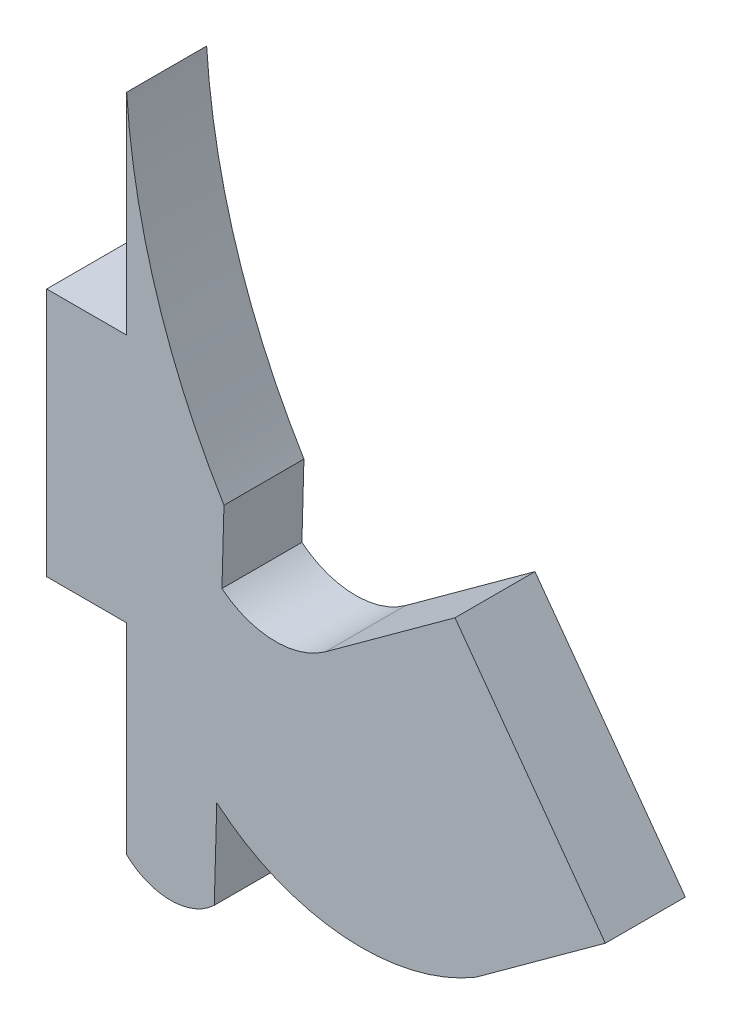
ISO-10303-21;
HEADER;
FILE_DESCRIPTION(('STEP AP214'),'2;1');
FILE_NAME('part.step','',(''),(''),'','','');
FILE_SCHEMA(('AUTOMOTIVE_DESIGN { 1 0 10303 214 1 1 1 1 }'));
ENDSEC;
DATA;
#1=APPLICATION_CONTEXT('core data for automotive mechanical design processes');
#2=APPLICATION_PROTOCOL_DEFINITION('international standard','automotive_design',2000,#1);
#3=PRODUCT_CONTEXT('',#1,'mechanical');
#4=PRODUCT('Part','Part','',(#3));
#5=PRODUCT_RELATED_PRODUCT_CATEGORY('part','',(#4));
#6=PRODUCT_DEFINITION_FORMATION('','',#4);
#7=PRODUCT_DEFINITION_CONTEXT('part definition',#1,'design');
#8=PRODUCT_DEFINITION('design','',#6,#7);
#9=PRODUCT_DEFINITION_SHAPE('','',#8);
#10=(LENGTH_UNIT() NAMED_UNIT(*) SI_UNIT(.MILLI.,.METRE.));
#11=(NAMED_UNIT(*) PLANE_ANGLE_UNIT() SI_UNIT($,.RADIAN.));
#12=(NAMED_UNIT(*) SI_UNIT($,.STERADIAN.) SOLID_ANGLE_UNIT());
#13=UNCERTAINTY_MEASURE_WITH_UNIT(LENGTH_MEASURE(1.E-05),#10,'distance_accuracy_value','');
#14=(GEOMETRIC_REPRESENTATION_CONTEXT(3) GLOBAL_UNCERTAINTY_ASSIGNED_CONTEXT((#13)) GLOBAL_UNIT_ASSIGNED_CONTEXT((#10,
#11,#12)) REPRESENTATION_CONTEXT('',''));
#15=CARTESIAN_POINT('',(0.,0.,0.));
#16=DIRECTION('',(0.,0.,1.));
#17=DIRECTION('',(1.,0.,0.));
#18=AXIS2_PLACEMENT_3D('',#15,#16,#17);
#19=CARTESIAN_POINT('',(1.524,26.9676802822344,1.524));
#20=DIRECTION('',(1.,0.,0.));
#21=DIRECTION('',(0.,0.,-1.));
#22=AXIS2_PLACEMENT_3D('',#19,#20,#21);
#23=PLANE('',#22);
#24=DIRECTION('',(0.,-1.,0.));
#25=VECTOR('',#24,1.);
#26=CARTESIAN_POINT('',(1.524,26.9676802822344,0.));
#27=LINE('',#26,#25);
#28=CARTESIAN_POINT('',(1.524,30.9773636520418,0.));
#29=VERTEX_POINT('',#28);
#30=CARTESIAN_POINT('',(1.524,26.9676802822344,0.));
#31=VERTEX_POINT('',#30);
#32=EDGE_CURVE('E165',#29,#31,#27,.T.);
#33=ORIENTED_EDGE('',*,*,#32,.T.);
#34=DIRECTION('',(0.,0.,-1.));
#35=VECTOR('',#34,1.);
#36=CARTESIAN_POINT('',(1.524,26.9676802822344,1.524));
#37=LINE('',#36,#35);
#38=CARTESIAN_POINT('',(1.524,26.9676802822344,1.524));
#39=VERTEX_POINT('',#38);
#40=EDGE_CURVE('E11',#39,#31,#37,.T.);
#41=ORIENTED_EDGE('',*,*,#40,.F.);
#42=DIRECTION('',(0.,-1.,0.));
#43=VECTOR('',#42,1.);
#44=CARTESIAN_POINT('',(1.524,26.9676802822344,1.524));
#45=LINE('',#44,#43);
#46=CARTESIAN_POINT('',(1.524,30.9773636520418,1.524));
#47=VERTEX_POINT('',#46);
#48=EDGE_CURVE('E191',#47,#39,#45,.T.);
#49=ORIENTED_EDGE('',*,*,#48,.F.);
#50=DIRECTION('',(0.,0.,-1.));
#51=VECTOR('',#50,1.);
#52=CARTESIAN_POINT('',(1.524,30.9773636520418,1.524));
#53=LINE('',#52,#51);
#54=EDGE_CURVE('E161',#47,#29,#53,.T.);
#55=ORIENTED_EDGE('',*,*,#54,.T.);
#56=EDGE_LOOP('',(#33,#41,#49,#55));
#57=FACE_BOUND('',#56,.T.);
#58=ADVANCED_FACE('F33',(#57),#23,.F.);
#59=CARTESIAN_POINT('',(1.524,26.9676802822344,1.524));
#60=DIRECTION('',(0.,-1.,0.));
#61=DIRECTION('',(0.,0.,-1.));
#62=AXIS2_PLACEMENT_3D('',#59,#60,#61);
#63=PLANE('',#62);
#64=DIRECTION('',(-1.,0.,0.));
#65=VECTOR('',#64,1.);
#66=CARTESIAN_POINT('',(1.524,26.9676802822344,0.));
#67=LINE('',#66,#65);
#68=CARTESIAN_POINT('',(0.,26.9676802822344,0.));
#69=VERTEX_POINT('',#68);
#70=EDGE_CURVE('E168',#31,#69,#67,.T.);
#71=ORIENTED_EDGE('',*,*,#70,.T.);
#72=DIRECTION('',(0.,0.,-1.));
#73=VECTOR('',#72,1.);
#74=CARTESIAN_POINT('',(0.,26.9676802822344,1.524));
#75=LINE('',#74,#73);
#76=CARTESIAN_POINT('',(0.,26.9676802822344,1.524));
#77=VERTEX_POINT('',#76);
#78=EDGE_CURVE('E41',#77,#69,#75,.T.);
#79=ORIENTED_EDGE('',*,*,#78,.F.);
#80=DIRECTION('',(-1.,0.,0.));
#81=VECTOR('',#80,1.);
#82=CARTESIAN_POINT('',(1.524,26.9676802822344,1.524));
#83=LINE('',#82,#81);
#84=EDGE_CURVE('E110',#39,#77,#83,.T.);
#85=ORIENTED_EDGE('',*,*,#84,.F.);
#86=ORIENTED_EDGE('',*,*,#40,.T.);
#87=EDGE_LOOP('',(#71,#79,#85,#86));
#88=FACE_BOUND('',#87,.T.);
#89=ADVANCED_FACE('F279',(#88),#63,.F.);
#90=CARTESIAN_POINT('',(0.,26.9676802822344,1.524));
#91=DIRECTION('',(1.,0.,0.));
#92=DIRECTION('',(0.,1.,0.));
#93=AXIS2_PLACEMENT_3D('',#90,#91,#92);
#94=PLANE('',#93);
#95=DIRECTION('',(0.,-1.,0.));
#96=VECTOR('',#95,1.);
#97=CARTESIAN_POINT('',(0.,26.9676802822344,0.));
#98=LINE('',#97,#96);
#99=CARTESIAN_POINT('',(0.,22.2178802822344,0.));
#100=VERTEX_POINT('',#99);
#101=EDGE_CURVE('E170',#69,#100,#98,.T.);
#102=ORIENTED_EDGE('',*,*,#101,.T.);
#103=DIRECTION('',(0.,0.,-1.));
#104=VECTOR('',#103,1.);
#105=CARTESIAN_POINT('',(0.,22.2178802822344,1.524));
#106=LINE('',#105,#104);
#107=CARTESIAN_POINT('',(0.,22.2178802822344,1.524));
#108=VERTEX_POINT('',#107);
#109=EDGE_CURVE('E216',#108,#100,#106,.T.);
#110=ORIENTED_EDGE('',*,*,#109,.F.);
#111=DIRECTION('',(0.,-1.,0.));
#112=VECTOR('',#111,1.);
#113=CARTESIAN_POINT('',(0.,26.9676802822344,1.524));
#114=LINE('',#113,#112);
#115=EDGE_CURVE('E224',#77,#108,#114,.T.);
#116=ORIENTED_EDGE('',*,*,#115,.F.);
#117=ORIENTED_EDGE('',*,*,#78,.T.);
#118=EDGE_LOOP('',(#102,#110,#116,#117));
#119=FACE_BOUND('',#118,.T.);
#120=ADVANCED_FACE('F222',(#119),#94,.F.);
#121=CARTESIAN_POINT('',(0.,22.2178802822344,1.524));
#122=DIRECTION('',(0.,1.,0.));
#123=DIRECTION('',(0.,0.,1.));
#124=AXIS2_PLACEMENT_3D('',#121,#122,#123);
#125=PLANE('',#124);
#126=DIRECTION('',(1.,0.,0.));
#127=VECTOR('',#126,1.);
#128=CARTESIAN_POINT('',(0.,22.2178802822344,0.));
#129=LINE('',#128,#127);
#130=CARTESIAN_POINT('',(1.524,22.2178802822344,0.));
#131=VERTEX_POINT('',#130);
#132=EDGE_CURVE('E172',#100,#131,#129,.T.);
#133=ORIENTED_EDGE('',*,*,#132,.T.);
#134=DIRECTION('',(0.,0.,-1.));
#135=VECTOR('',#134,1.);
#136=CARTESIAN_POINT('',(1.524,22.2178802822344,1.524));
#137=LINE('',#136,#135);
#138=CARTESIAN_POINT('',(1.524,22.2178802822344,1.524));
#139=VERTEX_POINT('',#138);
#140=EDGE_CURVE('E213',#139,#131,#137,.T.);
#141=ORIENTED_EDGE('',*,*,#140,.F.);
#142=DIRECTION('',(1.,0.,0.));
#143=VECTOR('',#142,1.);
#144=CARTESIAN_POINT('',(0.,22.2178802822344,1.524));
#145=LINE('',#144,#143);
#146=EDGE_CURVE('E242',#108,#139,#145,.T.);
#147=ORIENTED_EDGE('',*,*,#146,.F.);
#148=ORIENTED_EDGE('',*,*,#109,.T.);
#149=EDGE_LOOP('',(#133,#141,#147,#148));
#150=FACE_BOUND('',#149,.T.);
#151=ADVANCED_FACE('F233',(#150),#125,.F.);
#152=CARTESIAN_POINT('',(1.524,22.2178802822344,1.524));
#153=DIRECTION('',(1.,0.,0.));
#154=DIRECTION('',(0.,0.,-1.));
#155=AXIS2_PLACEMENT_3D('',#152,#153,#154);
#156=PLANE('',#155);
#157=DIRECTION('',(0.,-1.,0.));
#158=VECTOR('',#157,1.);
#159=CARTESIAN_POINT('',(1.524,22.2178802822344,0.));
#160=LINE('',#159,#158);
#161=CARTESIAN_POINT('',(1.524,18.3912713392971,0.));
#162=VERTEX_POINT('',#161);
#163=EDGE_CURVE('E174',#131,#162,#160,.T.);
#164=ORIENTED_EDGE('',*,*,#163,.T.);
#165=DIRECTION('',(0.,0.,-1.));
#166=VECTOR('',#165,1.);
#167=CARTESIAN_POINT('',(1.524,18.3912713392971,1.524));
#168=LINE('',#167,#166);
#169=CARTESIAN_POINT('',(1.524,18.3912713392971,1.524));
#170=VERTEX_POINT('',#169);
#171=EDGE_CURVE('E210',#170,#162,#168,.T.);
#172=ORIENTED_EDGE('',*,*,#171,.F.);
#173=DIRECTION('',(0.,-1.,0.));
#174=VECTOR('',#173,1.);
#175=CARTESIAN_POINT('',(1.524,22.2178802822344,1.524));
#176=LINE('',#175,#174);
#177=EDGE_CURVE('E239',#139,#170,#176,.T.);
#178=ORIENTED_EDGE('',*,*,#177,.F.);
#179=ORIENTED_EDGE('',*,*,#140,.T.);
#180=EDGE_LOOP('',(#164,#172,#178,#179));
#181=FACE_BOUND('',#180,.T.);
#182=ADVANCED_FACE('F237',(#181),#156,.F.);
#183=CARTESIAN_POINT('',(2.35885273270327,19.2678550541222,1.524));
#184=DIRECTION('',(0.,0.,-1.));
#185=DIRECTION('',(-1.,0.,0.));
#186=AXIS2_PLACEMENT_3D('',#183,#184,#185);
#187=CYLINDRICAL_SURFACE('',#186,1.21052802297128);
#188=CARTESIAN_POINT('',(2.35885273270327,19.2678550541222,0.));
#189=DIRECTION('',(0.,0.,1.));
#190=DIRECTION('',(1.,0.,0.));
#191=AXIS2_PLACEMENT_3D('',#188,#189,#190);
#192=CIRCLE('',#191,1.21052802297128);
#193=CARTESIAN_POINT('',(3.19370546540654,18.3912713392971,0.));
#194=VERTEX_POINT('',#193);
#195=EDGE_CURVE('E176',#162,#194,#192,.T.);
#196=ORIENTED_EDGE('',*,*,#195,.T.);
#197=DIRECTION('',(0.,0.,-1.));
#198=VECTOR('',#197,1.);
#199=CARTESIAN_POINT('',(3.19370546540654,18.3912713392971,1.524));
#200=LINE('',#199,#198);
#201=CARTESIAN_POINT('',(3.19370546540654,18.3912713392971,1.524));
#202=VERTEX_POINT('',#201);
#203=EDGE_CURVE('E207',#202,#194,#200,.T.);
#204=ORIENTED_EDGE('',*,*,#203,.F.);
#205=CARTESIAN_POINT('',(2.35885273270327,19.2678550541222,1.524));
#206=DIRECTION('',(0.,0.,1.));
#207=DIRECTION('',(1.,0.,0.));
#208=AXIS2_PLACEMENT_3D('',#205,#206,#207);
#209=CIRCLE('',#208,1.21052802297128);
#210=EDGE_CURVE('E241',#170,#202,#209,.T.);
#211=ORIENTED_EDGE('',*,*,#210,.F.);
#212=ORIENTED_EDGE('',*,*,#171,.T.);
#213=EDGE_LOOP('',(#196,#204,#211,#212));
#214=FACE_BOUND('',#213,.T.);
#215=ADVANCED_FACE('F292',(#214),#187,.T.);
#216=CARTESIAN_POINT('',(3.19370546540654,18.3912713392971,1.524));
#217=DIRECTION('',(-0.999619974008747,0.0275664209275025,0.));
#218=DIRECTION('',(-0.0275664209275025,-0.999619974008747,0.));
#219=AXIS2_PLACEMENT_3D('',#216,#217,#218);
#220=PLANE('',#219);
#221=DIRECTION('',(0.0275664209275025,0.999619974008747,0.));
#222=VECTOR('',#221,1.);
#223=CARTESIAN_POINT('',(3.19370546540654,18.3912713392971,0.));
#224=LINE('',#223,#222);
#225=CARTESIAN_POINT('',(3.24110572135515,20.1101104567863,0.));
#226=VERTEX_POINT('',#225);
#227=EDGE_CURVE('E178',#194,#226,#224,.T.);
#228=ORIENTED_EDGE('',*,*,#227,.T.);
#229=DIRECTION('',(0.,0.,-1.));
#230=VECTOR('',#229,1.);
#231=CARTESIAN_POINT('',(3.24110572135515,20.1101104567863,1.524));
#232=LINE('',#231,#230);
#233=CARTESIAN_POINT('',(3.24110572135515,20.1101104567863,1.524));
#234=VERTEX_POINT('',#233);
#235=EDGE_CURVE('E204',#234,#226,#232,.T.);
#236=ORIENTED_EDGE('',*,*,#235,.F.);
#237=DIRECTION('',(0.0275664209275025,0.999619974008747,0.));
#238=VECTOR('',#237,1.);
#239=CARTESIAN_POINT('',(3.19370546540654,18.3912713392971,1.524));
#240=LINE('',#239,#238);
#241=EDGE_CURVE('E244',#202,#234,#240,.T.);
#242=ORIENTED_EDGE('',*,*,#241,.F.);
#243=ORIENTED_EDGE('',*,*,#203,.T.);
#244=EDGE_LOOP('',(#228,#236,#242,#243));
#245=FACE_BOUND('',#244,.T.);
#246=ADVANCED_FACE('F295',(#245),#220,.F.);
#247=CARTESIAN_POINT('',(5.99816949100195,23.3530518170178,1.524));
#248=DIRECTION('',(0.,0.,-1.));
#249=DIRECTION('',(-1.,0.,0.));
#250=AXIS2_PLACEMENT_3D('',#247,#248,#249);
#251=CYLINDRICAL_SURFACE('',#250,4.25653254372605);
#252=CARTESIAN_POINT('',(5.99816949100195,23.3530518170178,0.));
#253=DIRECTION('',(0.,0.,1.));
#254=DIRECTION('',(1.,0.,0.));
#255=AXIS2_PLACEMENT_3D('',#252,#253,#254);
#256=CIRCLE('',#255,4.25653254372605);
#257=CARTESIAN_POINT('',(8.18148207060549,19.6991203075962,0.));
#258=VERTEX_POINT('',#257);
#259=EDGE_CURVE('E180',#226,#258,#256,.T.);
#260=ORIENTED_EDGE('',*,*,#259,.T.);
#261=DIRECTION('',(0.,0.,-1.));
#262=VECTOR('',#261,1.);
#263=CARTESIAN_POINT('',(8.18148207060549,19.6991203075962,1.524));
#264=LINE('',#263,#262);
#265=CARTESIAN_POINT('',(8.18148207060549,19.6991203075962,1.524));
#266=VERTEX_POINT('',#265);
#267=EDGE_CURVE('E201',#266,#258,#264,.T.);
#268=ORIENTED_EDGE('',*,*,#267,.F.);
#269=CARTESIAN_POINT('',(5.99816949100195,23.3530518170178,1.524));
#270=DIRECTION('',(0.,0.,1.));
#271=DIRECTION('',(1.,0.,0.));
#272=AXIS2_PLACEMENT_3D('',#269,#270,#271);
#273=CIRCLE('',#272,4.25653254372605);
#274=EDGE_CURVE('E250',#234,#266,#273,.T.);
#275=ORIENTED_EDGE('',*,*,#274,.F.);
#276=ORIENTED_EDGE('',*,*,#235,.T.);
#277=EDGE_LOOP('',(#260,#268,#275,#276));
#278=FACE_BOUND('',#277,.T.);
#279=ADVANCED_FACE('F299',(#278),#251,.T.);
#280=CARTESIAN_POINT('',(8.18148207060549,19.6991203075962,1.524));
#281=DIRECTION('',(-0.588155609867833,0.808747784281971,0.));
#282=DIRECTION('',(-0.808747784281971,-0.588155609867833,0.));
#283=AXIS2_PLACEMENT_3D('',#280,#281,#282);
#284=PLANE('',#283);
#285=DIRECTION('',(0.808747784281971,0.588155609867833,0.));
#286=VECTOR('',#285,1.);
#287=CARTESIAN_POINT('',(8.18148207060549,19.6991203075962,0.));
#288=LINE('',#287,#286);
#289=CARTESIAN_POINT('',(10.6465453170969,21.4918186064733,0.));
#290=VERTEX_POINT('',#289);
#291=EDGE_CURVE('E182',#258,#290,#288,.T.);
#292=ORIENTED_EDGE('',*,*,#291,.T.);
#293=DIRECTION('',(0.,0.,-1.));
#294=VECTOR('',#293,1.);
#295=CARTESIAN_POINT('',(10.6465453170969,21.4918186064733,1.524));
#296=LINE('',#295,#294);
#297=CARTESIAN_POINT('',(10.6465453170969,21.4918186064733,1.524));
#298=VERTEX_POINT('',#297);
#299=EDGE_CURVE('E198',#298,#290,#296,.T.);
#300=ORIENTED_EDGE('',*,*,#299,.F.);
#301=DIRECTION('',(0.808747784281971,0.588155609867833,0.));
#302=VECTOR('',#301,1.);
#303=CARTESIAN_POINT('',(8.18148207060549,19.6991203075962,1.524));
#304=LINE('',#303,#302);
#305=EDGE_CURVE('E252',#266,#298,#304,.T.);
#306=ORIENTED_EDGE('',*,*,#305,.F.);
#307=ORIENTED_EDGE('',*,*,#267,.T.);
#308=EDGE_LOOP('',(#292,#300,#306,#307));
#309=FACE_BOUND('',#308,.T.);
#310=ADVANCED_FACE('F303',(#309),#284,.F.);
#311=CARTESIAN_POINT('',(7.78159990313369,25.431283293637,1.524));
#312=DIRECTION('',(-0.80874778428197,-0.588155609867834,0.));
#313=DIRECTION('',(0.588155609867834,-0.80874778428197,0.));
#314=AXIS2_PLACEMENT_3D('',#311,#312,#313);
#315=PLANE('',#314);
#316=DIRECTION('',(-0.588155609867834,0.80874778428197,0.));
#317=VECTOR('',#316,1.);
#318=CARTESIAN_POINT('',(7.78159990313369,25.431283293637,0.));
#319=LINE('',#318,#317);
#320=CARTESIAN_POINT('',(7.78159990313369,25.431283293637,0.));
#321=VERTEX_POINT('',#320);
#322=EDGE_CURVE('E184',#290,#321,#319,.T.);
#323=ORIENTED_EDGE('',*,*,#322,.T.);
#324=DIRECTION('',(0.,0.,-1.));
#325=VECTOR('',#324,1.);
#326=CARTESIAN_POINT('',(7.78159990313369,25.431283293637,1.524));
#327=LINE('',#326,#325);
#328=CARTESIAN_POINT('',(7.78159990313369,25.431283293637,1.524));
#329=VERTEX_POINT('',#328);
#330=EDGE_CURVE('E195',#329,#321,#327,.T.);
#331=ORIENTED_EDGE('',*,*,#330,.F.);
#332=DIRECTION('',(-0.588155609867834,0.80874778428197,0.));
#333=VECTOR('',#332,1.);
#334=CARTESIAN_POINT('',(7.78159990313369,25.431283293637,1.524));
#335=LINE('',#334,#333);
#336=EDGE_CURVE('E254',#298,#329,#335,.T.);
#337=ORIENTED_EDGE('',*,*,#336,.F.);
#338=ORIENTED_EDGE('',*,*,#299,.T.);
#339=EDGE_LOOP('',(#323,#331,#337,#338));
#340=FACE_BOUND('',#339,.T.);
#341=ADVANCED_FACE('F260',(#340),#315,.F.);
#342=CARTESIAN_POINT('',(5.31653665664225,23.6385849947599,1.524));
#343=DIRECTION('',(0.588155609867833,-0.808747784281971,0.));
#344=DIRECTION('',(0.808747784281971,0.588155609867833,0.));
#345=AXIS2_PLACEMENT_3D('',#342,#343,#344);
#346=PLANE('',#345);
#347=DIRECTION('',(-0.808747784281971,-0.588155609867833,0.));
#348=VECTOR('',#347,1.);
#349=CARTESIAN_POINT('',(5.31653665664225,23.6385849947599,0.));
#350=LINE('',#349,#348);
#351=CARTESIAN_POINT('',(5.31653665664225,23.6385849947599,0.));
#352=VERTEX_POINT('',#351);
#353=EDGE_CURVE('E186',#321,#352,#350,.T.);
#354=ORIENTED_EDGE('',*,*,#353,.T.);
#355=DIRECTION('',(0.,0.,-1.));
#356=VECTOR('',#355,1.);
#357=CARTESIAN_POINT('',(5.31653665664225,23.6385849947599,1.524));
#358=LINE('',#357,#356);
#359=CARTESIAN_POINT('',(5.31653665664225,23.6385849947599,1.524));
#360=VERTEX_POINT('',#359);
#361=EDGE_CURVE('E156',#360,#352,#358,.T.);
#362=ORIENTED_EDGE('',*,*,#361,.F.);
#363=DIRECTION('',(-0.808747784281971,-0.588155609867833,0.));
#364=VECTOR('',#363,1.);
#365=CARTESIAN_POINT('',(5.31653665664225,23.6385849947599,1.524));
#366=LINE('',#365,#364);
#367=EDGE_CURVE('E147',#329,#360,#366,.T.);
#368=ORIENTED_EDGE('',*,*,#367,.F.);
#369=ORIENTED_EDGE('',*,*,#330,.T.);
#370=EDGE_LOOP('',(#354,#362,#368,#369));
#371=FACE_BOUND('',#370,.T.);
#372=ADVANCED_FACE('F264',(#371),#346,.F.);
#373=CARTESIAN_POINT('',(4.36360826267953,24.9489163327028,1.524));
#374=DIRECTION('',(0.,0.,-1.));
#375=DIRECTION('',(-1.,0.,0.));
#376=AXIS2_PLACEMENT_3D('',#373,#374,#375);
#377=CYLINDRICAL_SURFACE('',#376,1.62019774694805);
#378=CARTESIAN_POINT('',(4.36360826267953,24.9489163327028,0.));
#379=DIRECTION('',(0.,0.,-1.));
#380=DIRECTION('',(1.,0.,0.));
#381=AXIS2_PLACEMENT_3D('',#378,#379,#380);
#382=CIRCLE('',#381,1.62019774694805);
#383=CARTESIAN_POINT('',(3.33991330721905,23.6930941409175,0.));
#384=VERTEX_POINT('',#383);
#385=EDGE_CURVE('E155',#352,#384,#382,.T.);
#386=ORIENTED_EDGE('',*,*,#385,.T.);
#387=DIRECTION('',(0.,0.,-1.));
#388=VECTOR('',#387,1.);
#389=CARTESIAN_POINT('',(3.33991330721905,23.6930941409175,1.524));
#390=LINE('',#389,#388);
#391=CARTESIAN_POINT('',(3.33991330721905,23.6930941409175,1.524));
#392=VERTEX_POINT('',#391);
#393=EDGE_CURVE('E152',#392,#384,#390,.T.);
#394=ORIENTED_EDGE('',*,*,#393,.F.);
#395=CARTESIAN_POINT('',(4.36360826267953,24.9489163327028,1.524));
#396=DIRECTION('',(0.,0.,-1.));
#397=DIRECTION('',(1.,0.,0.));
#398=AXIS2_PLACEMENT_3D('',#395,#396,#397);
#399=CIRCLE('',#398,1.62019774694805);
#400=EDGE_CURVE('E141',#360,#392,#399,.T.);
#401=ORIENTED_EDGE('',*,*,#400,.F.);
#402=ORIENTED_EDGE('',*,*,#361,.T.);
#403=EDGE_LOOP('',(#386,#394,#401,#402));
#404=FACE_BOUND('',#403,.T.);
#405=ADVANCED_FACE('F153',(#404),#377,.F.);
#406=CARTESIAN_POINT('',(3.33991330721905,23.6930941409175,1.524));
#407=DIRECTION('',(-0.999619974008747,0.0275664209275025,0.));
#408=DIRECTION('',(-0.0275664209275025,-0.999619974008747,0.));
#409=AXIS2_PLACEMENT_3D('',#406,#407,#408);
#410=PLANE('',#409);
#411=DIRECTION('',(0.0275664209275025,0.999619974008747,0.));
#412=VECTOR('',#411,1.);
#413=CARTESIAN_POINT('',(3.33991330721905,23.6930941409175,0.));
#414=LINE('',#413,#412);
#415=CARTESIAN_POINT('',(3.37836534787783,25.0874509921388,0.));
#416=VERTEX_POINT('',#415);
#417=EDGE_CURVE('E96',#384,#416,#414,.T.);
#418=ORIENTED_EDGE('',*,*,#417,.T.);
#419=DIRECTION('',(0.,0.,-1.));
#420=VECTOR('',#419,1.);
#421=CARTESIAN_POINT('',(3.37836534787783,25.0874509921388,1.524));
#422=LINE('',#421,#420);
#423=CARTESIAN_POINT('',(3.37836534787783,25.0874509921388,1.524));
#424=VERTEX_POINT('',#423);
#425=EDGE_CURVE('E157',#424,#416,#422,.T.);
#426=ORIENTED_EDGE('',*,*,#425,.F.);
#427=DIRECTION('',(0.0275664209275025,0.999619974008747,0.));
#428=VECTOR('',#427,1.);
#429=CARTESIAN_POINT('',(3.33991330721905,23.6930941409175,1.524));
#430=LINE('',#429,#428);
#431=EDGE_CURVE('E145',#392,#424,#430,.T.);
#432=ORIENTED_EDGE('',*,*,#431,.F.);
#433=ORIENTED_EDGE('',*,*,#393,.T.);
#434=EDGE_LOOP('',(#418,#426,#432,#433));
#435=FACE_BOUND('',#434,.T.);
#436=ADVANCED_FACE('F159',(#435),#410,.F.);
#437=CARTESIAN_POINT('',(14.474101182375,31.8176728684168,1.524));
#438=DIRECTION('',(0.,0.,-1.));
#439=DIRECTION('',(-1.,0.,0.));
#440=AXIS2_PLACEMENT_3D('',#437,#438,#439);
#441=CYLINDRICAL_SURFACE('',#440,12.9773356361341);
#442=CARTESIAN_POINT('',(14.474101182375,31.8176728684168,0.));
#443=DIRECTION('',(0.,0.,-1.));
#444=DIRECTION('',(1.,0.,0.));
#445=AXIS2_PLACEMENT_3D('',#442,#443,#444);
#446=CIRCLE('',#445,12.9773356361341);
#447=EDGE_CURVE('E102',#416,#29,#446,.T.);
#448=ORIENTED_EDGE('',*,*,#447,.T.);
#449=ORIENTED_EDGE('',*,*,#54,.F.);
#450=CARTESIAN_POINT('',(14.474101182375,31.8176728684168,1.524));
#451=DIRECTION('',(0.,0.,-1.));
#452=DIRECTION('',(1.,0.,0.));
#453=AXIS2_PLACEMENT_3D('',#450,#451,#452);
#454=CIRCLE('',#453,12.9773356361341);
#455=EDGE_CURVE('E49',#424,#47,#454,.T.);
#456=ORIENTED_EDGE('',*,*,#455,.F.);
#457=ORIENTED_EDGE('',*,*,#425,.T.);
#458=EDGE_LOOP('',(#448,#449,#456,#457));
#459=FACE_BOUND('',#458,.T.);
#460=ADVANCED_FACE('F268',(#459),#441,.F.);
#461=CARTESIAN_POINT('',(14.474101182375,31.8176728684168,1.524));
#462=DIRECTION('',(0.,0.,1.));
#463=DIRECTION('',(1.,0.,0.));
#464=AXIS2_PLACEMENT_3D('',#461,#462,#463);
#465=PLANE('',#464);
#466=ORIENTED_EDGE('',*,*,#48,.T.);
#467=ORIENTED_EDGE('',*,*,#84,.T.);
#468=ORIENTED_EDGE('',*,*,#115,.T.);
#469=ORIENTED_EDGE('',*,*,#146,.T.);
#470=ORIENTED_EDGE('',*,*,#177,.T.);
#471=ORIENTED_EDGE('',*,*,#210,.T.);
#472=ORIENTED_EDGE('',*,*,#241,.T.);
#473=ORIENTED_EDGE('',*,*,#274,.T.);
#474=ORIENTED_EDGE('',*,*,#305,.T.);
#475=ORIENTED_EDGE('',*,*,#336,.T.);
#476=ORIENTED_EDGE('',*,*,#367,.T.);
#477=ORIENTED_EDGE('',*,*,#400,.T.);
#478=ORIENTED_EDGE('',*,*,#431,.T.);
#479=ORIENTED_EDGE('',*,*,#455,.T.);
#480=EDGE_LOOP('',(#466,#467,#468,#469,#470,#471,#472,#473,#474,#475,#476,#477,#478,#479));
#481=FACE_BOUND('',#480,.T.);
#482=ADVANCED_FACE('F143',(#481),#465,.T.);
#483=CARTESIAN_POINT('',(14.474101182375,31.8176728684168,0.));
#484=DIRECTION('',(0.,0.,1.));
#485=DIRECTION('',(1.,0.,0.));
#486=AXIS2_PLACEMENT_3D('',#483,#484,#485);
#487=PLANE('',#486);
#488=ORIENTED_EDGE('',*,*,#32,.F.);
#489=ORIENTED_EDGE('',*,*,#447,.F.);
#490=ORIENTED_EDGE('',*,*,#417,.F.);
#491=ORIENTED_EDGE('',*,*,#385,.F.);
#492=ORIENTED_EDGE('',*,*,#353,.F.);
#493=ORIENTED_EDGE('',*,*,#322,.F.);
#494=ORIENTED_EDGE('',*,*,#291,.F.);
#495=ORIENTED_EDGE('',*,*,#259,.F.);
#496=ORIENTED_EDGE('',*,*,#227,.F.);
#497=ORIENTED_EDGE('',*,*,#195,.F.);
#498=ORIENTED_EDGE('',*,*,#163,.F.);
#499=ORIENTED_EDGE('',*,*,#132,.F.);
#500=ORIENTED_EDGE('',*,*,#101,.F.);
#501=ORIENTED_EDGE('',*,*,#70,.F.);
#502=EDGE_LOOP('',(#488,#489,#490,#491,#492,#493,#494,#495,#496,#497,#498,#499,#500,#501));
#503=FACE_BOUND('',#502,.T.);
#504=ADVANCED_FACE('F228',(#503),#487,.F.);
#505=CLOSED_SHELL('',(#58,#89,#120,#151,#182,#215,#246,#279,#310,#341,#372,#405,#436,#460,#482,#504));
#506=MANIFOLD_SOLID_BREP('B2',#505);
#507=ADVANCED_BREP_SHAPE_REPRESENTATION('',(#18,#506),#14);
#508=SHAPE_DEFINITION_REPRESENTATION(#9,#507);
ENDSEC;
END-ISO-10303-21;
